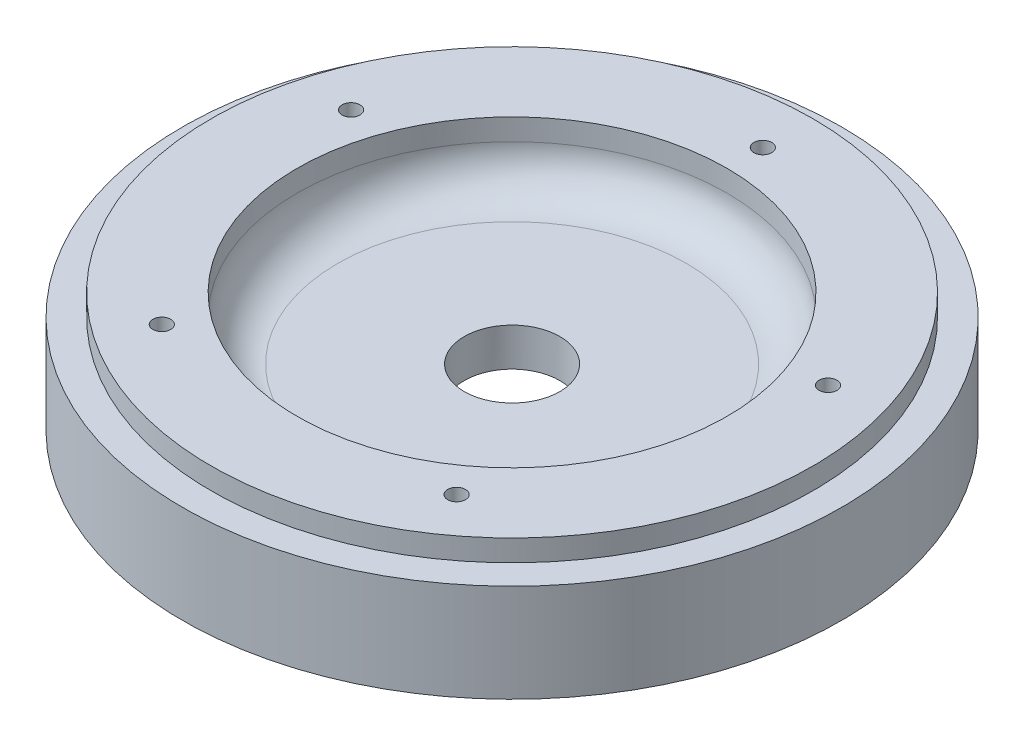
ISO-10303-21;
HEADER;
FILE_DESCRIPTION(('STEP AP214'),'2;1');
FILE_NAME('part.step','',(''),(''),'','','');
FILE_SCHEMA(('AUTOMOTIVE_DESIGN { 1 0 10303 214 1 1 1 1 }'));
ENDSEC;
DATA;
#1=APPLICATION_CONTEXT('core data for automotive mechanical design processes');
#2=APPLICATION_PROTOCOL_DEFINITION('international standard','automotive_design',2000,#1);
#3=PRODUCT_CONTEXT('',#1,'mechanical');
#4=PRODUCT('Part','Part','',(#3));
#5=PRODUCT_RELATED_PRODUCT_CATEGORY('part','',(#4));
#6=PRODUCT_DEFINITION_FORMATION('','',#4);
#7=PRODUCT_DEFINITION_CONTEXT('part definition',#1,'design');
#8=PRODUCT_DEFINITION('design','',#6,#7);
#9=PRODUCT_DEFINITION_SHAPE('','',#8);
#10=(LENGTH_UNIT() NAMED_UNIT(*) SI_UNIT(.MILLI.,.METRE.));
#11=(NAMED_UNIT(*) PLANE_ANGLE_UNIT() SI_UNIT($,.RADIAN.));
#12=(NAMED_UNIT(*) SI_UNIT($,.STERADIAN.) SOLID_ANGLE_UNIT());
#13=UNCERTAINTY_MEASURE_WITH_UNIT(LENGTH_MEASURE(1.E-05),#10,'distance_accuracy_value','');
#14=(GEOMETRIC_REPRESENTATION_CONTEXT(3) GLOBAL_UNCERTAINTY_ASSIGNED_CONTEXT((#13)) GLOBAL_UNIT_ASSIGNED_CONTEXT((#10,
#11,#12)) REPRESENTATION_CONTEXT('',''));
#15=CARTESIAN_POINT('',(0.,0.,0.));
#16=DIRECTION('',(0.,0.,1.));
#17=DIRECTION('',(1.,0.,0.));
#18=AXIS2_PLACEMENT_3D('',#15,#16,#17);
#19=CARTESIAN_POINT('',(0.,5.07999999999999,0.));
#20=DIRECTION('',(0.,-1.,0.));
#21=DIRECTION('',(0.,0.,-1.));
#22=AXIS2_PLACEMENT_3D('',#19,#20,#21);
#23=CYLINDRICAL_SURFACE('',#22,87.63);
#24=CARTESIAN_POINT('',(0.,26.035,0.));
#25=DIRECTION('',(0.,-1.,0.));
#26=DIRECTION('',(0.,0.,-1.));
#27=AXIS2_PLACEMENT_3D('',#24,#25,#26);
#28=CIRCLE('',#27,87.63);
#29=CARTESIAN_POINT('',(0.,26.035,-87.63));
#30=VERTEX_POINT('',#29);
#31=EDGE_CURVE('E127',#30,#30,#28,.T.);
#32=ORIENTED_EDGE('',*,*,#31,.T.);
#33=EDGE_LOOP('',(#32));
#34=FACE_BOUND('',#33,.T.);
#35=CARTESIAN_POINT('',(0.,0.,0.));
#36=DIRECTION('',(0.,-1.,0.));
#37=DIRECTION('',(0.,0.,-1.));
#38=AXIS2_PLACEMENT_3D('',#35,#36,#37);
#39=CIRCLE('',#38,87.63);
#40=CARTESIAN_POINT('',(0.,0.,-87.63));
#41=VERTEX_POINT('',#40);
#42=EDGE_CURVE('E147',#41,#41,#39,.T.);
#43=ORIENTED_EDGE('',*,*,#42,.F.);
#44=EDGE_LOOP('',(#43));
#45=FACE_BOUND('',#44,.T.);
#46=ADVANCED_FACE('F45',(#34,#45),#23,.T.);
#47=CARTESIAN_POINT('',(87.63,0.,0.));
#48=DIRECTION('',(0.,-1.,0.));
#49=DIRECTION('',(0.,0.,-1.));
#50=AXIS2_PLACEMENT_3D('',#47,#48,#49);
#51=PLANE('',#50);
#52=ORIENTED_EDGE('',*,*,#42,.T.);
#53=EDGE_LOOP('',(#52));
#54=FACE_BOUND('',#53,.T.);
#55=CARTESIAN_POINT('',(0.,0.,0.));
#56=DIRECTION('',(0.,-1.,0.));
#57=DIRECTION('',(0.,0.,-1.));
#58=AXIS2_PLACEMENT_3D('',#55,#56,#57);
#59=CIRCLE('',#58,57.15);
#60=CARTESIAN_POINT('',(0.,0.,-57.15));
#61=VERTEX_POINT('',#60);
#62=EDGE_CURVE('E143',#61,#61,#59,.T.);
#63=ORIENTED_EDGE('',*,*,#62,.F.);
#64=EDGE_LOOP('',(#63));
#65=FACE_BOUND('',#64,.T.);
#66=ADVANCED_FACE('F170',(#54,#65),#51,.T.);
#67=CARTESIAN_POINT('',(57.15,5.07999999999999,0.));
#68=DIRECTION('',(0.,-1.,0.));
#69=DIRECTION('',(0.,0.,-1.));
#70=AXIS2_PLACEMENT_3D('',#67,#68,#69);
#71=PLANE('',#70);
#72=CARTESIAN_POINT('',(0.,5.07999999999999,0.));
#73=DIRECTION('',(0.,-1.,0.));
#74=DIRECTION('',(0.,0.,-1.));
#75=AXIS2_PLACEMENT_3D('',#72,#73,#74);
#76=CIRCLE('',#75,47.9918997603215);
#77=CARTESIAN_POINT('',(0.,5.07999999999999,-47.9918997603215));
#78=VERTEX_POINT('',#77);
#79=EDGE_CURVE('E151',#78,#78,#76,.T.);
#80=ORIENTED_EDGE('',*,*,#79,.T.);
#81=EDGE_LOOP('',(#80));
#82=FACE_BOUND('',#81,.T.);
#83=CARTESIAN_POINT('',(0.,5.07999999999999,0.));
#84=DIRECTION('',(0.,-1.,0.));
#85=DIRECTION('',(0.,0.,-1.));
#86=AXIS2_PLACEMENT_3D('',#83,#84,#85);
#87=CIRCLE('',#86,12.7);
#88=CARTESIAN_POINT('',(0.,5.07999999999999,-12.7));
#89=VERTEX_POINT('',#88);
#90=EDGE_CURVE('E123',#89,#89,#87,.T.);
#91=ORIENTED_EDGE('',*,*,#90,.F.);
#92=EDGE_LOOP('',(#91));
#93=FACE_BOUND('',#92,.T.);
#94=ADVANCED_FACE('F176',(#82,#93),#71,.T.);
#95=CARTESIAN_POINT('',(0.,15.24,0.));
#96=DIRECTION('',(0.,1.,0.));
#97=DIRECTION('',(0.,0.,1.));
#98=AXIS2_PLACEMENT_3D('',#95,#96,#97);
#99=PLANE('',#98);
#100=CARTESIAN_POINT('',(0.,15.24,0.));
#101=DIRECTION('',(0.,1.,0.));
#102=DIRECTION('',(0.,0.,1.));
#103=AXIS2_PLACEMENT_3D('',#100,#101,#102);
#104=CIRCLE('',#103,46.355);
#105=CARTESIAN_POINT('',(0.,15.24,46.355));
#106=VERTEX_POINT('',#105);
#107=EDGE_CURVE('E11',#106,#106,#104,.T.);
#108=ORIENTED_EDGE('',*,*,#107,.T.);
#109=EDGE_LOOP('',(#108));
#110=FACE_BOUND('',#109,.T.);
#111=CARTESIAN_POINT('',(0.,15.24,0.));
#112=DIRECTION('',(0.,1.,0.));
#113=DIRECTION('',(0.,0.,1.));
#114=AXIS2_PLACEMENT_3D('',#111,#112,#113);
#115=CIRCLE('',#114,12.7);
#116=CARTESIAN_POINT('',(0.,15.24,12.7));
#117=VERTEX_POINT('',#116);
#118=EDGE_CURVE('E119',#117,#117,#115,.T.);
#119=ORIENTED_EDGE('',*,*,#118,.F.);
#120=EDGE_LOOP('',(#119));
#121=FACE_BOUND('',#120,.T.);
#122=ADVANCED_FACE('F183',(#110,#121),#99,.T.);
#123=CARTESIAN_POINT('',(0.,5.07999999999999,0.));
#124=DIRECTION('',(0.,-1.,0.));
#125=DIRECTION('',(0.,0.,-1.));
#126=AXIS2_PLACEMENT_3D('',#123,#124,#125);
#127=CYLINDRICAL_SURFACE('',#126,57.15);
#128=CARTESIAN_POINT('',(0.,26.035,0.));
#129=DIRECTION('',(0.,1.,0.));
#130=DIRECTION('',(0.,0.,1.));
#131=AXIS2_PLACEMENT_3D('',#128,#129,#130);
#132=CIRCLE('',#131,57.15);
#133=CARTESIAN_POINT('',(0.,26.035,57.15));
#134=VERTEX_POINT('',#133);
#135=EDGE_CURVE('E54',#134,#134,#132,.F.);
#136=ORIENTED_EDGE('',*,*,#135,.T.);
#137=EDGE_LOOP('',(#136));
#138=FACE_BOUND('',#137,.T.);
#139=CARTESIAN_POINT('',(0.,31.75,0.));
#140=DIRECTION('',(0.,-1.,0.));
#141=DIRECTION('',(0.,0.,-1.));
#142=AXIS2_PLACEMENT_3D('',#139,#140,#141);
#143=CIRCLE('',#142,57.15);
#144=CARTESIAN_POINT('',(0.,31.75,-57.15));
#145=VERTEX_POINT('',#144);
#146=EDGE_CURVE('E139',#145,#145,#143,.T.);
#147=ORIENTED_EDGE('',*,*,#146,.F.);
#148=EDGE_LOOP('',(#147));
#149=FACE_BOUND('',#148,.T.);
#150=ADVANCED_FACE('F158',(#138,#149),#127,.F.);
#151=CARTESIAN_POINT('',(57.15,31.75,0.));
#152=DIRECTION('',(0.,1.,0.));
#153=DIRECTION('',(0.,0.,1.));
#154=AXIS2_PLACEMENT_3D('',#151,#152,#153);
#155=PLANE('',#154);
#156=CARTESIAN_POINT('',(-63.4116932239791,31.75,-20.6037080999503));
#157=DIRECTION('',(0.,1.,0.));
#158=DIRECTION('',(0.,0.,1.));
#159=AXIS2_PLACEMENT_3D('',#156,#157,#158);
#160=CIRCLE('',#159,2.36855);
#161=CARTESIAN_POINT('',(-63.4116932239791,31.75,-18.2351580999503));
#162=VERTEX_POINT('',#161);
#163=EDGE_CURVE('E82',#162,#162,#160,.T.);
#164=ORIENTED_EDGE('',*,*,#163,.F.);
#165=EDGE_LOOP('',(#164));
#166=FACE_BOUND('',#165,.T.);
#167=CARTESIAN_POINT('',(-39.1905816966011,31.75,53.9412080999493));
#168=DIRECTION('',(0.,1.,0.));
#169=DIRECTION('',(0.,0.,1.));
#170=AXIS2_PLACEMENT_3D('',#167,#168,#169);
#171=CIRCLE('',#170,2.36855);
#172=CARTESIAN_POINT('',(-39.1905816966011,31.75,56.3097580999493));
#173=VERTEX_POINT('',#172);
#174=EDGE_CURVE('E81',#173,#173,#171,.T.);
#175=ORIENTED_EDGE('',*,*,#174,.F.);
#176=EDGE_LOOP('',(#175));
#177=FACE_BOUND('',#176,.T.);
#178=CARTESIAN_POINT('',(39.1905816966003,31.75,53.9412080999498));
#179=DIRECTION('',(0.,1.,0.));
#180=DIRECTION('',(0.,0.,1.));
#181=AXIS2_PLACEMENT_3D('',#178,#179,#180);
#182=CIRCLE('',#181,2.36855);
#183=CARTESIAN_POINT('',(39.1905816966003,31.75,56.3097580999498));
#184=VERTEX_POINT('',#183);
#185=EDGE_CURVE('E95',#184,#184,#182,.T.);
#186=ORIENTED_EDGE('',*,*,#185,.F.);
#187=EDGE_LOOP('',(#186));
#188=FACE_BOUND('',#187,.T.);
#189=CARTESIAN_POINT('',(63.4116932239794,31.75,-20.6037080999494));
#190=DIRECTION('',(0.,1.,0.));
#191=DIRECTION('',(0.,0.,1.));
#192=AXIS2_PLACEMENT_3D('',#189,#190,#191);
#193=CIRCLE('',#192,2.36855);
#194=CARTESIAN_POINT('',(63.4116932239794,31.75,-18.2351580999494));
#195=VERTEX_POINT('',#194);
#196=EDGE_CURVE('E103',#195,#195,#193,.T.);
#197=ORIENTED_EDGE('',*,*,#196,.F.);
#198=EDGE_LOOP('',(#197));
#199=FACE_BOUND('',#198,.T.);
#200=CARTESIAN_POINT('',(0.,31.75,-66.675));
#201=DIRECTION('',(0.,1.,0.));
#202=DIRECTION('',(0.,0.,1.));
#203=AXIS2_PLACEMENT_3D('',#200,#201,#202);
#204=CIRCLE('',#203,2.36855);
#205=CARTESIAN_POINT('',(0.,31.75,-64.30645));
#206=VERTEX_POINT('',#205);
#207=EDGE_CURVE('E111',#206,#206,#204,.T.);
#208=ORIENTED_EDGE('',*,*,#207,.F.);
#209=EDGE_LOOP('',(#208));
#210=FACE_BOUND('',#209,.T.);
#211=ORIENTED_EDGE('',*,*,#146,.T.);
#212=EDGE_LOOP('',(#211));
#213=FACE_BOUND('',#212,.T.);
#214=CARTESIAN_POINT('',(0.,31.75,0.));
#215=DIRECTION('',(0.,-1.,0.));
#216=DIRECTION('',(0.,0.,-1.));
#217=AXIS2_PLACEMENT_3D('',#214,#215,#216);
#218=CIRCLE('',#217,79.9973);
#219=CARTESIAN_POINT('',(0.,31.75,-79.9973));
#220=VERTEX_POINT('',#219);
#221=EDGE_CURVE('E135',#220,#220,#218,.T.);
#222=ORIENTED_EDGE('',*,*,#221,.F.);
#223=EDGE_LOOP('',(#222));
#224=FACE_BOUND('',#223,.T.);
#225=ADVANCED_FACE('F190',(#166,#177,#188,#199,#210,#213,#224),#155,.T.);
#226=CARTESIAN_POINT('',(0.,5.07999999999999,0.));
#227=DIRECTION('',(0.,-1.,0.));
#228=DIRECTION('',(0.,0.,-1.));
#229=AXIS2_PLACEMENT_3D('',#226,#227,#228);
#230=CYLINDRICAL_SURFACE('',#229,79.9973);
#231=ORIENTED_EDGE('',*,*,#221,.T.);
#232=EDGE_LOOP('',(#231));
#233=FACE_BOUND('',#232,.T.);
#234=CARTESIAN_POINT('',(0.,26.035,0.));
#235=DIRECTION('',(0.,-1.,0.));
#236=DIRECTION('',(0.,0.,-1.));
#237=AXIS2_PLACEMENT_3D('',#234,#235,#236);
#238=CIRCLE('',#237,79.9973);
#239=CARTESIAN_POINT('',(0.,26.035,-79.9973));
#240=VERTEX_POINT('',#239);
#241=EDGE_CURVE('E131',#240,#240,#238,.T.);
#242=ORIENTED_EDGE('',*,*,#241,.F.);
#243=EDGE_LOOP('',(#242));
#244=FACE_BOUND('',#243,.T.);
#245=ADVANCED_FACE('F193',(#233,#244),#230,.T.);
#246=CARTESIAN_POINT('',(79.9973,26.035,0.));
#247=DIRECTION('',(0.,1.,0.));
#248=DIRECTION('',(0.,0.,1.));
#249=AXIS2_PLACEMENT_3D('',#246,#247,#248);
#250=PLANE('',#249);
#251=ORIENTED_EDGE('',*,*,#241,.T.);
#252=EDGE_LOOP('',(#251));
#253=FACE_BOUND('',#252,.T.);
#254=ORIENTED_EDGE('',*,*,#31,.F.);
#255=EDGE_LOOP('',(#254));
#256=FACE_BOUND('',#255,.T.);
#257=ADVANCED_FACE('F197',(#253,#256),#250,.T.);
#258=CARTESIAN_POINT('',(0.,15.24,0.));
#259=DIRECTION('',(0.,1.,0.));
#260=DIRECTION('',(0.,0.,1.));
#261=AXIS2_PLACEMENT_3D('',#258,#259,#260);
#262=CYLINDRICAL_SURFACE('',#261,12.7);
#263=ORIENTED_EDGE('',*,*,#90,.T.);
#264=EDGE_LOOP('',(#263));
#265=FACE_BOUND('',#264,.T.);
#266=ORIENTED_EDGE('',*,*,#118,.T.);
#267=EDGE_LOOP('',(#266));
#268=FACE_BOUND('',#267,.T.);
#269=ADVANCED_FACE('F201',(#265,#268),#262,.F.);
#270=CARTESIAN_POINT('',(0.,19.05,-66.675));
#271=DIRECTION('',(0.,1.,0.));
#272=DIRECTION('',(0.,0.,1.));
#273=AXIS2_PLACEMENT_3D('',#270,#271,#272);
#274=CONICAL_SURFACE('',#273,2.36855,1.02974425867665);
#275=CARTESIAN_POINT('',(0.,17.6268315808023,-66.675));
#276=VERTEX_POINT('',#275);
#277=VERTEX_LOOP('',#276);
#278=FACE_BOUND('',#277,.T.);
#279=CARTESIAN_POINT('',(0.,19.05,-66.675));
#280=DIRECTION('',(0.,1.,0.));
#281=DIRECTION('',(0.,0.,1.));
#282=AXIS2_PLACEMENT_3D('',#279,#280,#281);
#283=CIRCLE('',#282,2.36855);
#284=CARTESIAN_POINT('',(0.,19.05,-64.30645));
#285=VERTEX_POINT('',#284);
#286=EDGE_CURVE('E115',#285,#285,#283,.T.);
#287=ORIENTED_EDGE('',*,*,#286,.T.);
#288=EDGE_LOOP('',(#287));
#289=FACE_BOUND('',#288,.T.);
#290=ADVANCED_FACE('F205',(#278,#289),#274,.F.);
#291=CARTESIAN_POINT('',(0.,31.75,-66.675));
#292=DIRECTION('',(0.,1.,0.));
#293=DIRECTION('',(0.,0.,1.));
#294=AXIS2_PLACEMENT_3D('',#291,#292,#293);
#295=CYLINDRICAL_SURFACE('',#294,2.36855);
#296=ORIENTED_EDGE('',*,*,#286,.F.);
#297=EDGE_LOOP('',(#296));
#298=FACE_BOUND('',#297,.T.);
#299=ORIENTED_EDGE('',*,*,#207,.T.);
#300=EDGE_LOOP('',(#299));
#301=FACE_BOUND('',#300,.T.);
#302=ADVANCED_FACE('F209',(#298,#301),#295,.F.);
#303=CARTESIAN_POINT('',(63.4116932239794,19.05,-20.6037080999494));
#304=DIRECTION('',(0.,1.,0.));
#305=DIRECTION('',(0.,0.,1.));
#306=AXIS2_PLACEMENT_3D('',#303,#304,#305);
#307=CONICAL_SURFACE('',#306,2.36855,1.02974425867665);
#308=CARTESIAN_POINT('',(63.4116932239794,17.6268315808023,-20.6037080999494));
#309=VERTEX_POINT('',#308);
#310=VERTEX_LOOP('',#309);
#311=FACE_BOUND('',#310,.T.);
#312=CARTESIAN_POINT('',(63.4116932239794,19.05,-20.6037080999494));
#313=DIRECTION('',(0.,1.,0.));
#314=DIRECTION('',(0.,0.,1.));
#315=AXIS2_PLACEMENT_3D('',#312,#313,#314);
#316=CIRCLE('',#315,2.36855);
#317=CARTESIAN_POINT('',(63.4116932239794,19.05,-18.2351580999494));
#318=VERTEX_POINT('',#317);
#319=EDGE_CURVE('E107',#318,#318,#316,.T.);
#320=ORIENTED_EDGE('',*,*,#319,.T.);
#321=EDGE_LOOP('',(#320));
#322=FACE_BOUND('',#321,.T.);
#323=ADVANCED_FACE('F212',(#311,#322),#307,.F.);
#324=CARTESIAN_POINT('',(63.4116932239794,31.75,-20.6037080999494));
#325=DIRECTION('',(0.,1.,0.));
#326=DIRECTION('',(0.,0.,1.));
#327=AXIS2_PLACEMENT_3D('',#324,#325,#326);
#328=CYLINDRICAL_SURFACE('',#327,2.36855);
#329=ORIENTED_EDGE('',*,*,#319,.F.);
#330=EDGE_LOOP('',(#329));
#331=FACE_BOUND('',#330,.T.);
#332=ORIENTED_EDGE('',*,*,#196,.T.);
#333=EDGE_LOOP('',(#332));
#334=FACE_BOUND('',#333,.T.);
#335=ADVANCED_FACE('F216',(#331,#334),#328,.F.);
#336=CARTESIAN_POINT('',(39.1905816966003,19.05,53.9412080999498));
#337=DIRECTION('',(0.,1.,0.));
#338=DIRECTION('',(0.,0.,1.));
#339=AXIS2_PLACEMENT_3D('',#336,#337,#338);
#340=CONICAL_SURFACE('',#339,2.36855,1.02974425867665);
#341=CARTESIAN_POINT('',(39.1905816966003,17.6268315808023,53.9412080999498));
#342=VERTEX_POINT('',#341);
#343=VERTEX_LOOP('',#342);
#344=FACE_BOUND('',#343,.T.);
#345=CARTESIAN_POINT('',(39.1905816966003,19.05,53.9412080999498));
#346=DIRECTION('',(0.,1.,0.));
#347=DIRECTION('',(0.,0.,1.));
#348=AXIS2_PLACEMENT_3D('',#345,#346,#347);
#349=CIRCLE('',#348,2.36855);
#350=CARTESIAN_POINT('',(39.1905816966003,19.05,56.3097580999498));
#351=VERTEX_POINT('',#350);
#352=EDGE_CURVE('E99',#351,#351,#349,.T.);
#353=ORIENTED_EDGE('',*,*,#352,.T.);
#354=EDGE_LOOP('',(#353));
#355=FACE_BOUND('',#354,.T.);
#356=ADVANCED_FACE('F219',(#344,#355),#340,.F.);
#357=CARTESIAN_POINT('',(39.1905816966003,31.75,53.9412080999498));
#358=DIRECTION('',(0.,1.,0.));
#359=DIRECTION('',(0.,0.,1.));
#360=AXIS2_PLACEMENT_3D('',#357,#358,#359);
#361=CYLINDRICAL_SURFACE('',#360,2.36855);
#362=ORIENTED_EDGE('',*,*,#352,.F.);
#363=EDGE_LOOP('',(#362));
#364=FACE_BOUND('',#363,.T.);
#365=ORIENTED_EDGE('',*,*,#185,.T.);
#366=EDGE_LOOP('',(#365));
#367=FACE_BOUND('',#366,.T.);
#368=ADVANCED_FACE('F223',(#364,#367),#361,.F.);
#369=CARTESIAN_POINT('',(-39.1905816966011,19.05,53.9412080999493));
#370=DIRECTION('',(0.,1.,0.));
#371=DIRECTION('',(0.,0.,1.));
#372=AXIS2_PLACEMENT_3D('',#369,#370,#371);
#373=CONICAL_SURFACE('',#372,2.36855,1.02974425867665);
#374=CARTESIAN_POINT('',(-39.1905816966011,17.6268315808023,53.9412080999493));
#375=VERTEX_POINT('',#374);
#376=VERTEX_LOOP('',#375);
#377=FACE_BOUND('',#376,.T.);
#378=CARTESIAN_POINT('',(-39.1905816966011,19.05,53.9412080999493));
#379=DIRECTION('',(0.,1.,0.));
#380=DIRECTION('',(0.,0.,1.));
#381=AXIS2_PLACEMENT_3D('',#378,#379,#380);
#382=CIRCLE('',#381,2.36855);
#383=CARTESIAN_POINT('',(-39.1905816966011,19.05,56.3097580999493));
#384=VERTEX_POINT('',#383);
#385=EDGE_CURVE('E87',#384,#384,#382,.T.);
#386=ORIENTED_EDGE('',*,*,#385,.T.);
#387=EDGE_LOOP('',(#386));
#388=FACE_BOUND('',#387,.T.);
#389=ADVANCED_FACE('F227',(#377,#388),#373,.F.);
#390=CARTESIAN_POINT('',(-39.1905816966011,31.75,53.9412080999493));
#391=DIRECTION('',(0.,1.,0.));
#392=DIRECTION('',(0.,0.,1.));
#393=AXIS2_PLACEMENT_3D('',#390,#391,#392);
#394=CYLINDRICAL_SURFACE('',#393,2.36855);
#395=ORIENTED_EDGE('',*,*,#385,.F.);
#396=EDGE_LOOP('',(#395));
#397=FACE_BOUND('',#396,.T.);
#398=ORIENTED_EDGE('',*,*,#174,.T.);
#399=EDGE_LOOP('',(#398));
#400=FACE_BOUND('',#399,.T.);
#401=ADVANCED_FACE('F74',(#397,#400),#394,.F.);
#402=CARTESIAN_POINT('',(-63.4116932239791,19.05,-20.6037080999503));
#403=DIRECTION('',(0.,1.,0.));
#404=DIRECTION('',(0.,0.,1.));
#405=AXIS2_PLACEMENT_3D('',#402,#403,#404);
#406=CONICAL_SURFACE('',#405,2.36855,1.02974425867665);
#407=CARTESIAN_POINT('',(-63.4116932239791,17.6268315808023,-20.6037080999503));
#408=VERTEX_POINT('',#407);
#409=VERTEX_LOOP('',#408);
#410=FACE_BOUND('',#409,.T.);
#411=CARTESIAN_POINT('',(-63.4116932239791,19.05,-20.6037080999503));
#412=DIRECTION('',(0.,1.,0.));
#413=DIRECTION('',(0.,0.,1.));
#414=AXIS2_PLACEMENT_3D('',#411,#412,#413);
#415=CIRCLE('',#414,2.36855);
#416=CARTESIAN_POINT('',(-63.4116932239791,19.05,-18.2351580999503));
#417=VERTEX_POINT('',#416);
#418=EDGE_CURVE('E78',#417,#417,#415,.T.);
#419=ORIENTED_EDGE('',*,*,#418,.T.);
#420=EDGE_LOOP('',(#419));
#421=FACE_BOUND('',#420,.T.);
#422=ADVANCED_FACE('F70',(#410,#421),#406,.F.);
#423=CARTESIAN_POINT('',(-63.4116932239791,31.75,-20.6037080999503));
#424=DIRECTION('',(0.,1.,0.));
#425=DIRECTION('',(0.,0.,1.));
#426=AXIS2_PLACEMENT_3D('',#423,#424,#425);
#427=CYLINDRICAL_SURFACE('',#426,2.36855);
#428=ORIENTED_EDGE('',*,*,#418,.F.);
#429=EDGE_LOOP('',(#428));
#430=FACE_BOUND('',#429,.T.);
#431=ORIENTED_EDGE('',*,*,#163,.T.);
#432=EDGE_LOOP('',(#431));
#433=FACE_BOUND('',#432,.T.);
#434=ADVANCED_FACE('F73',(#430,#433),#427,.F.);
#435=CARTESIAN_POINT('',(0.,-5.71500000000001,0.));
#436=DIRECTION('',(0.,1.,0.));
#437=DIRECTION('',(0.,0.,1.));
#438=AXIS2_PLACEMENT_3D('',#435,#436,#437);
#439=TOROIDAL_SURFACE('',#438,47.9918997603215,10.795);
#440=ORIENTED_EDGE('',*,*,#62,.T.);
#441=EDGE_LOOP('',(#440));
#442=FACE_BOUND('',#441,.T.);
#443=ORIENTED_EDGE('',*,*,#79,.F.);
#444=EDGE_LOOP('',(#443));
#445=FACE_BOUND('',#444,.T.);
#446=ADVANCED_FACE('F162',(#442,#445),#439,.F.);
#447=CARTESIAN_POINT('',(0.,26.035,0.));
#448=DIRECTION('',(0.,1.,0.));
#449=DIRECTION('',(0.,0.,1.));
#450=AXIS2_PLACEMENT_3D('',#447,#448,#449);
#451=TOROIDAL_SURFACE('',#450,46.355,10.795);
#452=ORIENTED_EDGE('',*,*,#107,.F.);
#453=EDGE_LOOP('',(#452));
#454=FACE_BOUND('',#453,.T.);
#455=ORIENTED_EDGE('',*,*,#135,.F.);
#456=EDGE_LOOP('',(#455));
#457=FACE_BOUND('',#456,.T.);
#458=ADVANCED_FACE('F47',(#454,#457),#451,.F.);
#459=CLOSED_SHELL('',(#46,#66,#94,#122,#150,#225,#245,#257,#269,#290,#302,#323,#335,#356,#368,
#389,#401,#422,#434,#446,#458));
#460=MANIFOLD_SOLID_BREP('B2',#459);
#461=ADVANCED_BREP_SHAPE_REPRESENTATION('',(#18,#460),#14);
#462=SHAPE_DEFINITION_REPRESENTATION(#9,#461);
ENDSEC;
END-ISO-10303-21;
